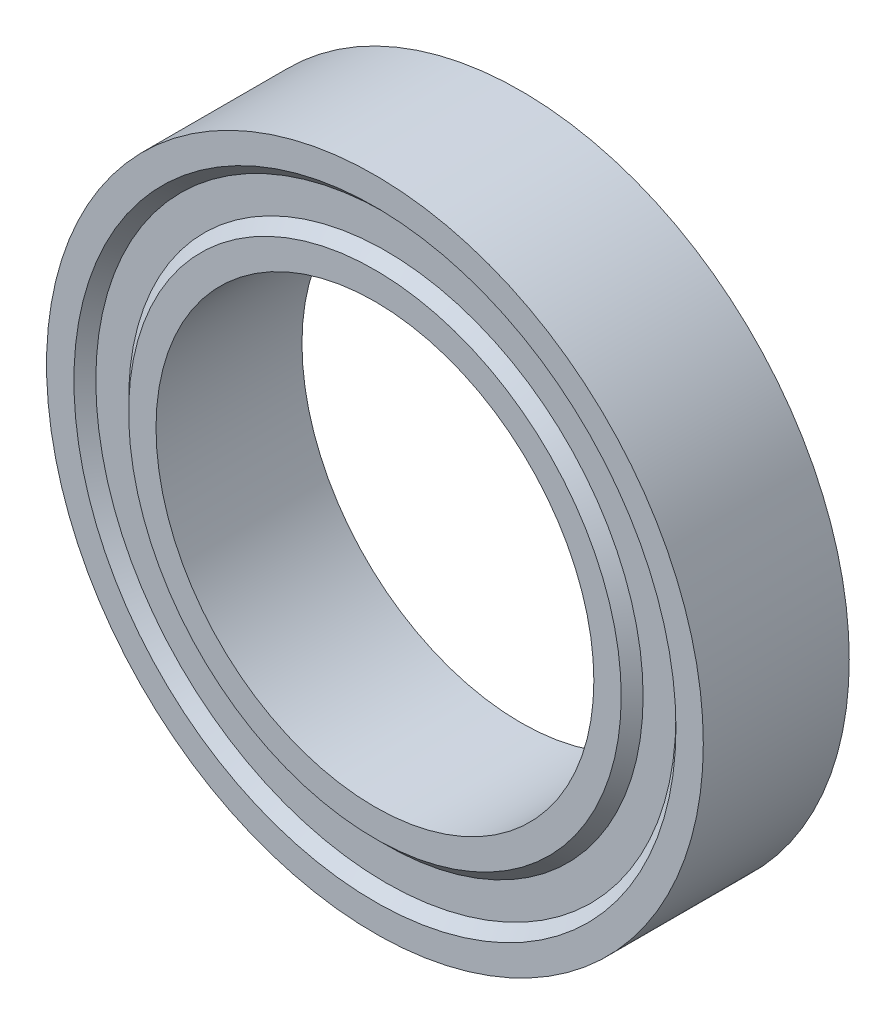
ISO-10303-21;
HEADER;
FILE_DESCRIPTION(('STEP AP214'),'2;1');
FILE_NAME('part.step','',(''),(''),'','','');
FILE_SCHEMA(('AUTOMOTIVE_DESIGN { 1 0 10303 214 1 1 1 1 }'));
ENDSEC;
DATA;
#1=APPLICATION_CONTEXT('core data for automotive mechanical design processes');
#2=APPLICATION_PROTOCOL_DEFINITION('international standard','automotive_design',2000,#1);
#3=PRODUCT_CONTEXT('',#1,'mechanical');
#4=PRODUCT('Part','Part','',(#3));
#5=PRODUCT_RELATED_PRODUCT_CATEGORY('part','',(#4));
#6=PRODUCT_DEFINITION_FORMATION('','',#4);
#7=PRODUCT_DEFINITION_CONTEXT('part definition',#1,'design');
#8=PRODUCT_DEFINITION('design','',#6,#7);
#9=PRODUCT_DEFINITION_SHAPE('','',#8);
#10=(LENGTH_UNIT() NAMED_UNIT(*) SI_UNIT(.MILLI.,.METRE.));
#11=(NAMED_UNIT(*) PLANE_ANGLE_UNIT() SI_UNIT($,.RADIAN.));
#12=(NAMED_UNIT(*) SI_UNIT($,.STERADIAN.) SOLID_ANGLE_UNIT());
#13=UNCERTAINTY_MEASURE_WITH_UNIT(LENGTH_MEASURE(1.E-05),#10,'distance_accuracy_value','');
#14=(GEOMETRIC_REPRESENTATION_CONTEXT(3) GLOBAL_UNCERTAINTY_ASSIGNED_CONTEXT((#13)) GLOBAL_UNIT_ASSIGNED_CONTEXT((#10,
#11,#12)) REPRESENTATION_CONTEXT('',''));
#15=CARTESIAN_POINT('',(0.,0.,0.));
#16=DIRECTION('',(0.,0.,1.));
#17=DIRECTION('',(1.,0.,0.));
#18=AXIS2_PLACEMENT_3D('',#15,#16,#17);
#19=CARTESIAN_POINT('',(0.,0.,0.));
#20=DIRECTION('',(0.,0.,1.));
#21=DIRECTION('',(1.,0.,0.));
#22=AXIS2_PLACEMENT_3D('',#19,#20,#21);
#23=CYLINDRICAL_SURFACE('',#22,6.);
#24=CARTESIAN_POINT('',(0.,0.,-2.));
#25=DIRECTION('',(0.,0.,1.));
#26=DIRECTION('',(1.,0.,0.));
#27=AXIS2_PLACEMENT_3D('',#24,#25,#26);
#28=CIRCLE('',#27,6.);
#29=CARTESIAN_POINT('',(6.,0.,-2.));
#30=VERTEX_POINT('',#29);
#31=EDGE_CURVE('E79',#30,#30,#28,.T.);
#32=ORIENTED_EDGE('',*,*,#31,.F.);
#33=EDGE_LOOP('',(#32));
#34=FACE_BOUND('',#33,.T.);
#35=CARTESIAN_POINT('',(0.,0.,2.));
#36=DIRECTION('',(0.,0.,1.));
#37=DIRECTION('',(1.,0.,0.));
#38=AXIS2_PLACEMENT_3D('',#35,#36,#37);
#39=CIRCLE('',#38,6.);
#40=CARTESIAN_POINT('',(6.,0.,2.));
#41=VERTEX_POINT('',#40);
#42=EDGE_CURVE('E10',#41,#41,#39,.T.);
#43=ORIENTED_EDGE('',*,*,#42,.T.);
#44=EDGE_LOOP('',(#43));
#45=FACE_BOUND('',#44,.T.);
#46=ADVANCED_FACE('F39',(#34,#45),#23,.F.);
#47=CARTESIAN_POINT('',(0.,0.,2.));
#48=DIRECTION('',(0.,0.,1.));
#49=DIRECTION('',(1.,0.,0.));
#50=AXIS2_PLACEMENT_3D('',#47,#48,#49);
#51=PLANE('',#50);
#52=CARTESIAN_POINT('',(0.,0.,2.));
#53=DIRECTION('',(0.,0.,1.));
#54=DIRECTION('',(1.,0.,0.));
#55=AXIS2_PLACEMENT_3D('',#52,#53,#54);
#56=CIRCLE('',#55,6.75);
#57=CARTESIAN_POINT('',(6.75,0.,2.));
#58=VERTEX_POINT('',#57);
#59=EDGE_CURVE('E45',#58,#58,#56,.T.);
#60=ORIENTED_EDGE('',*,*,#59,.T.);
#61=EDGE_LOOP('',(#60));
#62=FACE_BOUND('',#61,.T.);
#63=ORIENTED_EDGE('',*,*,#42,.F.);
#64=EDGE_LOOP('',(#63));
#65=FACE_BOUND('',#64,.T.);
#66=ADVANCED_FACE('F86',(#62,#65),#51,.T.);
#67=CARTESIAN_POINT('',(0.,0.,2.));
#68=DIRECTION('',(0.,0.,-1.));
#69=DIRECTION('',(-1.,0.,0.));
#70=AXIS2_PLACEMENT_3D('',#67,#68,#69);
#71=CONICAL_SURFACE('',#70,6.75,0.785398163397445);
#72=CARTESIAN_POINT('',(0.,0.,1.7));
#73=DIRECTION('',(0.,0.,1.));
#74=DIRECTION('',(1.,0.,0.));
#75=AXIS2_PLACEMENT_3D('',#72,#73,#74);
#76=CIRCLE('',#75,7.05);
#77=CARTESIAN_POINT('',(7.05,0.,1.7));
#78=VERTEX_POINT('',#77);
#79=EDGE_CURVE('E49',#78,#78,#76,.T.);
#80=ORIENTED_EDGE('',*,*,#79,.T.);
#81=EDGE_LOOP('',(#80));
#82=FACE_BOUND('',#81,.T.);
#83=ORIENTED_EDGE('',*,*,#59,.F.);
#84=EDGE_LOOP('',(#83));
#85=FACE_BOUND('',#84,.T.);
#86=ADVANCED_FACE('F90',(#82,#85),#71,.T.);
#87=CARTESIAN_POINT('',(0.,0.,1.7));
#88=DIRECTION('',(0.,0.,1.));
#89=DIRECTION('',(1.,0.,0.));
#90=AXIS2_PLACEMENT_3D('',#87,#88,#89);
#91=PLANE('',#90);
#92=CARTESIAN_POINT('',(0.,0.,1.70000000000001));
#93=DIRECTION('',(0.,0.,1.));
#94=DIRECTION('',(1.,0.,0.));
#95=AXIS2_PLACEMENT_3D('',#92,#93,#94);
#96=CIRCLE('',#95,7.95);
#97=CARTESIAN_POINT('',(7.95,0.,1.70000000000001));
#98=VERTEX_POINT('',#97);
#99=EDGE_CURVE('E53',#98,#98,#96,.T.);
#100=ORIENTED_EDGE('',*,*,#99,.T.);
#101=EDGE_LOOP('',(#100));
#102=FACE_BOUND('',#101,.T.);
#103=ORIENTED_EDGE('',*,*,#79,.F.);
#104=EDGE_LOOP('',(#103));
#105=FACE_BOUND('',#104,.T.);
#106=ADVANCED_FACE('F94',(#102,#105),#91,.T.);
#107=CARTESIAN_POINT('',(0.,0.,1.70000000000001));
#108=DIRECTION('',(0.,0.,1.));
#109=DIRECTION('',(1.,0.,0.));
#110=AXIS2_PLACEMENT_3D('',#107,#108,#109);
#111=CONICAL_SURFACE('',#110,7.95,0.785398163397453);
#112=CARTESIAN_POINT('',(0.,0.,2.));
#113=DIRECTION('',(0.,0.,1.));
#114=DIRECTION('',(1.,0.,0.));
#115=AXIS2_PLACEMENT_3D('',#112,#113,#114);
#116=CIRCLE('',#115,8.25);
#117=CARTESIAN_POINT('',(8.25,0.,2.));
#118=VERTEX_POINT('',#117);
#119=EDGE_CURVE('E58',#118,#118,#116,.T.);
#120=ORIENTED_EDGE('',*,*,#119,.T.);
#121=EDGE_LOOP('',(#120));
#122=FACE_BOUND('',#121,.T.);
#123=ORIENTED_EDGE('',*,*,#99,.F.);
#124=EDGE_LOOP('',(#123));
#125=FACE_BOUND('',#124,.T.);
#126=ADVANCED_FACE('F101',(#122,#125),#111,.F.);
#127=CARTESIAN_POINT('',(0.,0.,2.));
#128=DIRECTION('',(0.,0.,1.));
#129=DIRECTION('',(1.,0.,0.));
#130=AXIS2_PLACEMENT_3D('',#127,#128,#129);
#131=PLANE('',#130);
#132=CARTESIAN_POINT('',(0.,0.,2.));
#133=DIRECTION('',(0.,0.,1.));
#134=DIRECTION('',(1.,0.,0.));
#135=AXIS2_PLACEMENT_3D('',#132,#133,#134);
#136=CIRCLE('',#135,9.);
#137=CARTESIAN_POINT('',(9.,0.,2.));
#138=VERTEX_POINT('',#137);
#139=EDGE_CURVE('E61',#138,#138,#136,.T.);
#140=ORIENTED_EDGE('',*,*,#139,.T.);
#141=EDGE_LOOP('',(#140));
#142=FACE_BOUND('',#141,.T.);
#143=ORIENTED_EDGE('',*,*,#119,.F.);
#144=EDGE_LOOP('',(#143));
#145=FACE_BOUND('',#144,.T.);
#146=ADVANCED_FACE('F105',(#142,#145),#131,.T.);
#147=CARTESIAN_POINT('',(0.,0.,0.));
#148=DIRECTION('',(0.,0.,1.));
#149=DIRECTION('',(1.,0.,0.));
#150=AXIS2_PLACEMENT_3D('',#147,#148,#149);
#151=CYLINDRICAL_SURFACE('',#150,9.);
#152=ORIENTED_EDGE('',*,*,#139,.F.);
#153=EDGE_LOOP('',(#152));
#154=FACE_BOUND('',#153,.T.);
#155=CARTESIAN_POINT('',(0.,0.,-2.));
#156=DIRECTION('',(0.,0.,1.));
#157=DIRECTION('',(1.,0.,0.));
#158=AXIS2_PLACEMENT_3D('',#155,#156,#157);
#159=CIRCLE('',#158,9.);
#160=CARTESIAN_POINT('',(9.,0.,-2.));
#161=VERTEX_POINT('',#160);
#162=EDGE_CURVE('E64',#161,#161,#159,.T.);
#163=ORIENTED_EDGE('',*,*,#162,.T.);
#164=EDGE_LOOP('',(#163));
#165=FACE_BOUND('',#164,.T.);
#166=ADVANCED_FACE('F109',(#154,#165),#151,.T.);
#167=CARTESIAN_POINT('',(0.,0.,-2.));
#168=DIRECTION('',(0.,0.,1.));
#169=DIRECTION('',(1.,0.,0.));
#170=AXIS2_PLACEMENT_3D('',#167,#168,#169);
#171=PLANE('',#170);
#172=ORIENTED_EDGE('',*,*,#162,.F.);
#173=EDGE_LOOP('',(#172));
#174=FACE_BOUND('',#173,.T.);
#175=CARTESIAN_POINT('',(0.,0.,-2.));
#176=DIRECTION('',(0.,0.,1.));
#177=DIRECTION('',(1.,0.,0.));
#178=AXIS2_PLACEMENT_3D('',#175,#176,#177);
#179=CIRCLE('',#178,8.25);
#180=CARTESIAN_POINT('',(8.25,0.,-2.));
#181=VERTEX_POINT('',#180);
#182=EDGE_CURVE('E67',#181,#181,#179,.T.);
#183=ORIENTED_EDGE('',*,*,#182,.T.);
#184=EDGE_LOOP('',(#183));
#185=FACE_BOUND('',#184,.T.);
#186=ADVANCED_FACE('F113',(#174,#185),#171,.F.);
#187=CARTESIAN_POINT('',(0.,0.,-1.7));
#188=DIRECTION('',(0.,0.,-1.));
#189=DIRECTION('',(-1.,0.,0.));
#190=AXIS2_PLACEMENT_3D('',#187,#188,#189);
#191=CONICAL_SURFACE('',#190,7.95,0.785398163397456);
#192=ORIENTED_EDGE('',*,*,#182,.F.);
#193=EDGE_LOOP('',(#192));
#194=FACE_BOUND('',#193,.T.);
#195=CARTESIAN_POINT('',(0.,0.,-1.7));
#196=DIRECTION('',(0.,0.,1.));
#197=DIRECTION('',(1.,0.,0.));
#198=AXIS2_PLACEMENT_3D('',#195,#196,#197);
#199=CIRCLE('',#198,7.95);
#200=CARTESIAN_POINT('',(7.95,0.,-1.7));
#201=VERTEX_POINT('',#200);
#202=EDGE_CURVE('E70',#201,#201,#199,.T.);
#203=ORIENTED_EDGE('',*,*,#202,.T.);
#204=EDGE_LOOP('',(#203));
#205=FACE_BOUND('',#204,.T.);
#206=ADVANCED_FACE('F117',(#194,#205),#191,.F.);
#207=CARTESIAN_POINT('',(0.,0.,-1.7));
#208=DIRECTION('',(0.,0.,1.));
#209=DIRECTION('',(1.,0.,0.));
#210=AXIS2_PLACEMENT_3D('',#207,#208,#209);
#211=PLANE('',#210);
#212=ORIENTED_EDGE('',*,*,#202,.F.);
#213=EDGE_LOOP('',(#212));
#214=FACE_BOUND('',#213,.T.);
#215=CARTESIAN_POINT('',(0.,0.,-1.7));
#216=DIRECTION('',(0.,0.,1.));
#217=DIRECTION('',(1.,0.,0.));
#218=AXIS2_PLACEMENT_3D('',#215,#216,#217);
#219=CIRCLE('',#218,7.05);
#220=CARTESIAN_POINT('',(7.05,0.,-1.7));
#221=VERTEX_POINT('',#220);
#222=EDGE_CURVE('E73',#221,#221,#219,.T.);
#223=ORIENTED_EDGE('',*,*,#222,.T.);
#224=EDGE_LOOP('',(#223));
#225=FACE_BOUND('',#224,.T.);
#226=ADVANCED_FACE('F121',(#214,#225),#211,.F.);
#227=CARTESIAN_POINT('',(0.,0.,-2.));
#228=DIRECTION('',(0.,0.,1.));
#229=DIRECTION('',(1.,0.,0.));
#230=AXIS2_PLACEMENT_3D('',#227,#228,#229);
#231=CONICAL_SURFACE('',#230,6.75,0.78539816339745);
#232=ORIENTED_EDGE('',*,*,#222,.F.);
#233=EDGE_LOOP('',(#232));
#234=FACE_BOUND('',#233,.T.);
#235=CARTESIAN_POINT('',(0.,0.,-2.));
#236=DIRECTION('',(0.,0.,1.));
#237=DIRECTION('',(1.,0.,0.));
#238=AXIS2_PLACEMENT_3D('',#235,#236,#237);
#239=CIRCLE('',#238,6.75);
#240=CARTESIAN_POINT('',(6.75,0.,-2.));
#241=VERTEX_POINT('',#240);
#242=EDGE_CURVE('E76',#241,#241,#239,.T.);
#243=ORIENTED_EDGE('',*,*,#242,.T.);
#244=EDGE_LOOP('',(#243));
#245=FACE_BOUND('',#244,.T.);
#246=ADVANCED_FACE('F125',(#234,#245),#231,.T.);
#247=CARTESIAN_POINT('',(0.,0.,-2.));
#248=DIRECTION('',(0.,0.,1.));
#249=DIRECTION('',(1.,0.,0.));
#250=AXIS2_PLACEMENT_3D('',#247,#248,#249);
#251=PLANE('',#250);
#252=ORIENTED_EDGE('',*,*,#242,.F.);
#253=EDGE_LOOP('',(#252));
#254=FACE_BOUND('',#253,.T.);
#255=ORIENTED_EDGE('',*,*,#31,.T.);
#256=EDGE_LOOP('',(#255));
#257=FACE_BOUND('',#256,.T.);
#258=ADVANCED_FACE('F83',(#254,#257),#251,.F.);
#259=CLOSED_SHELL('',(#46,#66,#86,#106,#126,#146,#166,#186,#206,#226,#246,#258));
#260=MANIFOLD_SOLID_BREP('B2',#259);
#261=ADVANCED_BREP_SHAPE_REPRESENTATION('',(#18,#260),#14);
#262=SHAPE_DEFINITION_REPRESENTATION(#9,#261);
ENDSEC;
END-ISO-10303-21;
